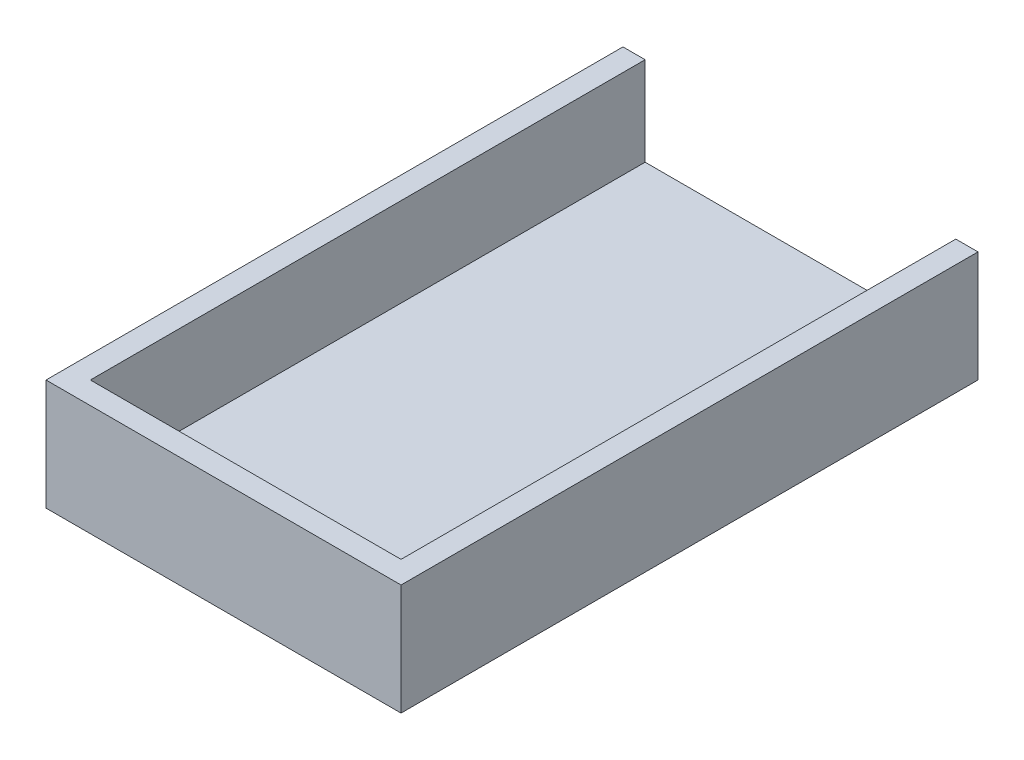
ISO-10303-21;
HEADER;
FILE_DESCRIPTION(('STEP AP214'),'2;1');
FILE_NAME('part.step','',(''),(''),'','','');
FILE_SCHEMA(('AUTOMOTIVE_DESIGN { 1 0 10303 214 1 1 1 1 }'));
ENDSEC;
DATA;
#1=APPLICATION_CONTEXT('core data for automotive mechanical design processes');
#2=APPLICATION_PROTOCOL_DEFINITION('international standard','automotive_design',2000,#1);
#3=PRODUCT_CONTEXT('',#1,'mechanical');
#4=PRODUCT('Part','Part','',(#3));
#5=PRODUCT_RELATED_PRODUCT_CATEGORY('part','',(#4));
#6=PRODUCT_DEFINITION_FORMATION('','',#4);
#7=PRODUCT_DEFINITION_CONTEXT('part definition',#1,'design');
#8=PRODUCT_DEFINITION('design','',#6,#7);
#9=PRODUCT_DEFINITION_SHAPE('','',#8);
#10=(LENGTH_UNIT() NAMED_UNIT(*) SI_UNIT(.MILLI.,.METRE.));
#11=(NAMED_UNIT(*) PLANE_ANGLE_UNIT() SI_UNIT($,.RADIAN.));
#12=(NAMED_UNIT(*) SI_UNIT($,.STERADIAN.) SOLID_ANGLE_UNIT());
#13=UNCERTAINTY_MEASURE_WITH_UNIT(LENGTH_MEASURE(1.E-05),#10,'distance_accuracy_value','');
#14=(GEOMETRIC_REPRESENTATION_CONTEXT(3) GLOBAL_UNCERTAINTY_ASSIGNED_CONTEXT((#13)) GLOBAL_UNIT_ASSIGNED_CONTEXT((#10,
#11,#12)) REPRESENTATION_CONTEXT('',''));
#15=CARTESIAN_POINT('',(0.,0.,0.));
#16=DIRECTION('',(0.,0.,1.));
#17=DIRECTION('',(1.,0.,0.));
#18=AXIS2_PLACEMENT_3D('',#15,#16,#17);
#19=CARTESIAN_POINT('',(8.,5.,-13.));
#20=DIRECTION('',(0.,0.,1.));
#21=DIRECTION('',(1.,0.,0.));
#22=AXIS2_PLACEMENT_3D('',#19,#20,#21);
#23=PLANE('',#22);
#24=DIRECTION('',(0.,-1.,0.));
#25=VECTOR('',#24,1.);
#26=CARTESIAN_POINT('',(-7.,11.,-13.));
#27=LINE('',#26,#25);
#28=CARTESIAN_POINT('',(-7.,5.,-13.));
#29=VERTEX_POINT('',#28);
#30=CARTESIAN_POINT('',(-7.,1.,-13.));
#31=VERTEX_POINT('',#30);
#32=EDGE_CURVE('E134',#29,#31,#27,.T.);
#33=ORIENTED_EDGE('',*,*,#32,.T.);
#34=DIRECTION('',(-1.,0.,0.));
#35=VECTOR('',#34,1.);
#36=CARTESIAN_POINT('',(-7.,1.,-13.));
#37=LINE('',#36,#35);
#38=CARTESIAN_POINT('',(7.,1.,-13.));
#39=VERTEX_POINT('',#38);
#40=EDGE_CURVE('E129',#39,#31,#37,.T.);
#41=ORIENTED_EDGE('',*,*,#40,.F.);
#42=DIRECTION('',(0.,-1.,0.));
#43=VECTOR('',#42,1.);
#44=CARTESIAN_POINT('',(7.,11.,-13.));
#45=LINE('',#44,#43);
#46=CARTESIAN_POINT('',(7.,5.,-13.));
#47=VERTEX_POINT('',#46);
#48=EDGE_CURVE('E136',#47,#39,#45,.T.);
#49=ORIENTED_EDGE('',*,*,#48,.F.);
#50=DIRECTION('',(-1.,0.,0.));
#51=VECTOR('',#50,1.);
#52=CARTESIAN_POINT('',(8.,5.,-13.));
#53=LINE('',#52,#51);
#54=CARTESIAN_POINT('',(8.,5.,-13.));
#55=VERTEX_POINT('',#54);
#56=EDGE_CURVE('E144',#55,#47,#53,.T.);
#57=ORIENTED_EDGE('',*,*,#56,.F.);
#58=DIRECTION('',(0.,-1.,0.));
#59=VECTOR('',#58,1.);
#60=CARTESIAN_POINT('',(8.,5.,-13.));
#61=LINE('',#60,#59);
#62=CARTESIAN_POINT('',(8.,0.,-13.));
#63=VERTEX_POINT('',#62);
#64=EDGE_CURVE('E155',#55,#63,#61,.T.);
#65=ORIENTED_EDGE('',*,*,#64,.T.);
#66=DIRECTION('',(-1.,0.,0.));
#67=VECTOR('',#66,1.);
#68=CARTESIAN_POINT('',(8.,0.,-13.));
#69=LINE('',#68,#67);
#70=CARTESIAN_POINT('',(-8.,0.,-13.));
#71=VERTEX_POINT('',#70);
#72=EDGE_CURVE('E77',#63,#71,#69,.T.);
#73=ORIENTED_EDGE('',*,*,#72,.T.);
#74=DIRECTION('',(0.,-1.,0.));
#75=VECTOR('',#74,1.);
#76=CARTESIAN_POINT('',(-8.,5.,-13.));
#77=LINE('',#76,#75);
#78=CARTESIAN_POINT('',(-8.,5.,-13.));
#79=VERTEX_POINT('',#78);
#80=EDGE_CURVE('E146',#79,#71,#77,.T.);
#81=ORIENTED_EDGE('',*,*,#80,.F.);
#82=EDGE_CURVE('E55',#29,#79,#53,.T.);
#83=ORIENTED_EDGE('',*,*,#82,.F.);
#84=EDGE_LOOP('',(#33,#41,#49,#57,#65,#73,#81,#83));
#85=FACE_BOUND('',#84,.T.);
#86=ADVANCED_FACE('F33',(#85),#23,.F.);
#87=CARTESIAN_POINT('',(0.,5.,0.));
#88=DIRECTION('',(0.,1.,0.));
#89=DIRECTION('',(0.,0.,1.));
#90=AXIS2_PLACEMENT_3D('',#87,#88,#89);
#91=PLANE('',#90);
#92=DIRECTION('',(-1.,0.,0.));
#93=VECTOR('',#92,1.);
#94=CARTESIAN_POINT('',(0.,5.,12.));
#95=LINE('',#94,#93);
#96=CARTESIAN_POINT('',(7.,5.,12.));
#97=VERTEX_POINT('',#96);
#98=CARTESIAN_POINT('',(-7.,5.,12.));
#99=VERTEX_POINT('',#98);
#100=EDGE_CURVE('E41',#97,#99,#95,.T.);
#101=ORIENTED_EDGE('',*,*,#100,.T.);
#102=DIRECTION('',(0.,0.,-1.));
#103=VECTOR('',#102,1.);
#104=CARTESIAN_POINT('',(-7.,5.,0.));
#105=LINE('',#104,#103);
#106=EDGE_CURVE('E11',#99,#29,#105,.T.);
#107=ORIENTED_EDGE('',*,*,#106,.T.);
#108=ORIENTED_EDGE('',*,*,#82,.T.);
#109=DIRECTION('',(0.,0.,1.));
#110=VECTOR('',#109,1.);
#111=CARTESIAN_POINT('',(-8.,5.,13.));
#112=LINE('',#111,#110);
#113=CARTESIAN_POINT('',(-8.,5.,13.));
#114=VERTEX_POINT('',#113);
#115=EDGE_CURVE('E139',#79,#114,#112,.T.);
#116=ORIENTED_EDGE('',*,*,#115,.T.);
#117=DIRECTION('',(1.,0.,0.));
#118=VECTOR('',#117,1.);
#119=CARTESIAN_POINT('',(8.,5.,13.));
#120=LINE('',#119,#118);
#121=CARTESIAN_POINT('',(8.,5.,13.));
#122=VERTEX_POINT('',#121);
#123=EDGE_CURVE('E85',#114,#122,#120,.T.);
#124=ORIENTED_EDGE('',*,*,#123,.T.);
#125=DIRECTION('',(0.,0.,-1.));
#126=VECTOR('',#125,1.);
#127=CARTESIAN_POINT('',(8.,5.,13.));
#128=LINE('',#127,#126);
#129=EDGE_CURVE('E142',#122,#55,#128,.T.);
#130=ORIENTED_EDGE('',*,*,#129,.T.);
#131=ORIENTED_EDGE('',*,*,#56,.T.);
#132=DIRECTION('',(0.,0.,1.));
#133=VECTOR('',#132,1.);
#134=CARTESIAN_POINT('',(7.,5.,0.));
#135=LINE('',#134,#133);
#136=EDGE_CURVE('E48',#47,#97,#135,.T.);
#137=ORIENTED_EDGE('',*,*,#136,.T.);
#138=EDGE_LOOP('',(#101,#107,#108,#116,#124,#130,#131,#137));
#139=FACE_BOUND('',#138,.T.);
#140=ADVANCED_FACE('F162',(#139),#91,.T.);
#141=CARTESIAN_POINT('',(-8.,5.,13.));
#142=DIRECTION('',(1.,0.,0.));
#143=DIRECTION('',(0.,0.,-1.));
#144=AXIS2_PLACEMENT_3D('',#141,#142,#143);
#145=PLANE('',#144);
#146=DIRECTION('',(0.,0.,1.));
#147=VECTOR('',#146,1.);
#148=CARTESIAN_POINT('',(-8.,0.,13.));
#149=LINE('',#148,#147);
#150=CARTESIAN_POINT('',(-8.,0.,13.));
#151=VERTEX_POINT('',#150);
#152=EDGE_CURVE('E116',#71,#151,#149,.T.);
#153=ORIENTED_EDGE('',*,*,#152,.T.);
#154=DIRECTION('',(0.,-1.,0.));
#155=VECTOR('',#154,1.);
#156=CARTESIAN_POINT('',(-8.,5.,13.));
#157=LINE('',#156,#155);
#158=EDGE_CURVE('E160',#114,#151,#157,.T.);
#159=ORIENTED_EDGE('',*,*,#158,.F.);
#160=ORIENTED_EDGE('',*,*,#115,.F.);
#161=ORIENTED_EDGE('',*,*,#80,.T.);
#162=EDGE_LOOP('',(#153,#159,#160,#161));
#163=FACE_BOUND('',#162,.T.);
#164=ADVANCED_FACE('F35',(#163),#145,.F.);
#165=CARTESIAN_POINT('',(8.,5.,13.));
#166=DIRECTION('',(0.,0.,-1.));
#167=DIRECTION('',(-1.,0.,0.));
#168=AXIS2_PLACEMENT_3D('',#165,#166,#167);
#169=PLANE('',#168);
#170=DIRECTION('',(1.,0.,0.));
#171=VECTOR('',#170,1.);
#172=CARTESIAN_POINT('',(8.,0.,13.));
#173=LINE('',#172,#171);
#174=CARTESIAN_POINT('',(8.,0.,13.));
#175=VERTEX_POINT('',#174);
#176=EDGE_CURVE('E149',#151,#175,#173,.T.);
#177=ORIENTED_EDGE('',*,*,#176,.T.);
#178=DIRECTION('',(0.,-1.,0.));
#179=VECTOR('',#178,1.);
#180=CARTESIAN_POINT('',(8.,5.,13.));
#181=LINE('',#180,#179);
#182=EDGE_CURVE('E157',#122,#175,#181,.T.);
#183=ORIENTED_EDGE('',*,*,#182,.F.);
#184=ORIENTED_EDGE('',*,*,#123,.F.);
#185=ORIENTED_EDGE('',*,*,#158,.T.);
#186=EDGE_LOOP('',(#177,#183,#184,#185));
#187=FACE_BOUND('',#186,.T.);
#188=ADVANCED_FACE('F169',(#187),#169,.F.);
#189=CARTESIAN_POINT('',(8.,5.,13.));
#190=DIRECTION('',(-1.,0.,0.));
#191=DIRECTION('',(0.,0.,1.));
#192=AXIS2_PLACEMENT_3D('',#189,#190,#191);
#193=PLANE('',#192);
#194=DIRECTION('',(0.,0.,-1.));
#195=VECTOR('',#194,1.);
#196=CARTESIAN_POINT('',(8.,0.,13.));
#197=LINE('',#196,#195);
#198=EDGE_CURVE('E151',#175,#63,#197,.T.);
#199=ORIENTED_EDGE('',*,*,#198,.T.);
#200=ORIENTED_EDGE('',*,*,#64,.F.);
#201=ORIENTED_EDGE('',*,*,#129,.F.);
#202=ORIENTED_EDGE('',*,*,#182,.T.);
#203=EDGE_LOOP('',(#199,#200,#201,#202));
#204=FACE_BOUND('',#203,.T.);
#205=ADVANCED_FACE('F172',(#204),#193,.F.);
#206=CARTESIAN_POINT('',(0.,0.,0.));
#207=DIRECTION('',(0.,1.,0.));
#208=DIRECTION('',(0.,0.,1.));
#209=AXIS2_PLACEMENT_3D('',#206,#207,#208);
#210=PLANE('',#209);
#211=ORIENTED_EDGE('',*,*,#152,.F.);
#212=ORIENTED_EDGE('',*,*,#72,.F.);
#213=ORIENTED_EDGE('',*,*,#198,.F.);
#214=ORIENTED_EDGE('',*,*,#176,.F.);
#215=EDGE_LOOP('',(#211,#212,#213,#214));
#216=FACE_BOUND('',#215,.T.);
#217=ADVANCED_FACE('F193',(#216),#210,.F.);
#218=CARTESIAN_POINT('',(-7.,11.,-13.));
#219=DIRECTION('',(1.,0.,0.));
#220=DIRECTION('',(0.,0.,-1.));
#221=AXIS2_PLACEMENT_3D('',#218,#219,#220);
#222=PLANE('',#221);
#223=DIRECTION('',(0.,-1.,0.));
#224=VECTOR('',#223,1.);
#225=CARTESIAN_POINT('',(-7.,11.,12.));
#226=LINE('',#225,#224);
#227=CARTESIAN_POINT('',(-7.,1.,12.));
#228=VERTEX_POINT('',#227);
#229=EDGE_CURVE('E107',#99,#228,#226,.T.);
#230=ORIENTED_EDGE('',*,*,#229,.T.);
#231=DIRECTION('',(0.,0.,1.));
#232=VECTOR('',#231,1.);
#233=CARTESIAN_POINT('',(-7.,1.,-13.));
#234=LINE('',#233,#232);
#235=EDGE_CURVE('E112',#31,#228,#234,.T.);
#236=ORIENTED_EDGE('',*,*,#235,.F.);
#237=ORIENTED_EDGE('',*,*,#32,.F.);
#238=ORIENTED_EDGE('',*,*,#106,.F.);
#239=EDGE_LOOP('',(#230,#236,#237,#238));
#240=FACE_BOUND('',#239,.T.);
#241=ADVANCED_FACE('F109',(#240),#222,.T.);
#242=CARTESIAN_POINT('',(-7.,11.,12.));
#243=DIRECTION('',(0.,0.,-1.));
#244=DIRECTION('',(-1.,0.,0.));
#245=AXIS2_PLACEMENT_3D('',#242,#243,#244);
#246=PLANE('',#245);
#247=DIRECTION('',(0.,-1.,0.));
#248=VECTOR('',#247,1.);
#249=CARTESIAN_POINT('',(7.,11.,12.));
#250=LINE('',#249,#248);
#251=CARTESIAN_POINT('',(7.,1.,12.));
#252=VERTEX_POINT('',#251);
#253=EDGE_CURVE('E117',#97,#252,#250,.T.);
#254=ORIENTED_EDGE('',*,*,#253,.T.);
#255=DIRECTION('',(1.,0.,0.));
#256=VECTOR('',#255,1.);
#257=CARTESIAN_POINT('',(-7.,1.,12.));
#258=LINE('',#257,#256);
#259=EDGE_CURVE('E120',#228,#252,#258,.T.);
#260=ORIENTED_EDGE('',*,*,#259,.F.);
#261=ORIENTED_EDGE('',*,*,#229,.F.);
#262=ORIENTED_EDGE('',*,*,#100,.F.);
#263=EDGE_LOOP('',(#254,#260,#261,#262));
#264=FACE_BOUND('',#263,.T.);
#265=ADVANCED_FACE('F121',(#264),#246,.T.);
#266=CARTESIAN_POINT('',(7.,11.,-13.));
#267=DIRECTION('',(-1.,0.,0.));
#268=DIRECTION('',(0.,0.,1.));
#269=AXIS2_PLACEMENT_3D('',#266,#267,#268);
#270=PLANE('',#269);
#271=ORIENTED_EDGE('',*,*,#48,.T.);
#272=DIRECTION('',(0.,0.,-1.));
#273=VECTOR('',#272,1.);
#274=CARTESIAN_POINT('',(7.,1.,-13.));
#275=LINE('',#274,#273);
#276=EDGE_CURVE('E125',#252,#39,#275,.T.);
#277=ORIENTED_EDGE('',*,*,#276,.F.);
#278=ORIENTED_EDGE('',*,*,#253,.F.);
#279=ORIENTED_EDGE('',*,*,#136,.F.);
#280=EDGE_LOOP('',(#271,#277,#278,#279));
#281=FACE_BOUND('',#280,.T.);
#282=ADVANCED_FACE('F176',(#281),#270,.T.);
#283=CARTESIAN_POINT('',(0.,1.,0.));
#284=DIRECTION('',(0.,1.,0.));
#285=DIRECTION('',(0.,0.,1.));
#286=AXIS2_PLACEMENT_3D('',#283,#284,#285);
#287=PLANE('',#286);
#288=ORIENTED_EDGE('',*,*,#235,.T.);
#289=ORIENTED_EDGE('',*,*,#259,.T.);
#290=ORIENTED_EDGE('',*,*,#276,.T.);
#291=ORIENTED_EDGE('',*,*,#40,.T.);
#292=EDGE_LOOP('',(#288,#289,#290,#291));
#293=FACE_BOUND('',#292,.T.);
#294=ADVANCED_FACE('F127',(#293),#287,.T.);
#295=CLOSED_SHELL('',(#86,#140,#164,#188,#205,#217,#241,#265,#282,#294));
#296=MANIFOLD_SOLID_BREP('B2',#295);
#297=ADVANCED_BREP_SHAPE_REPRESENTATION('',(#18,#296),#14);
#298=SHAPE_DEFINITION_REPRESENTATION(#9,#297);
ENDSEC;
END-ISO-10303-21;
